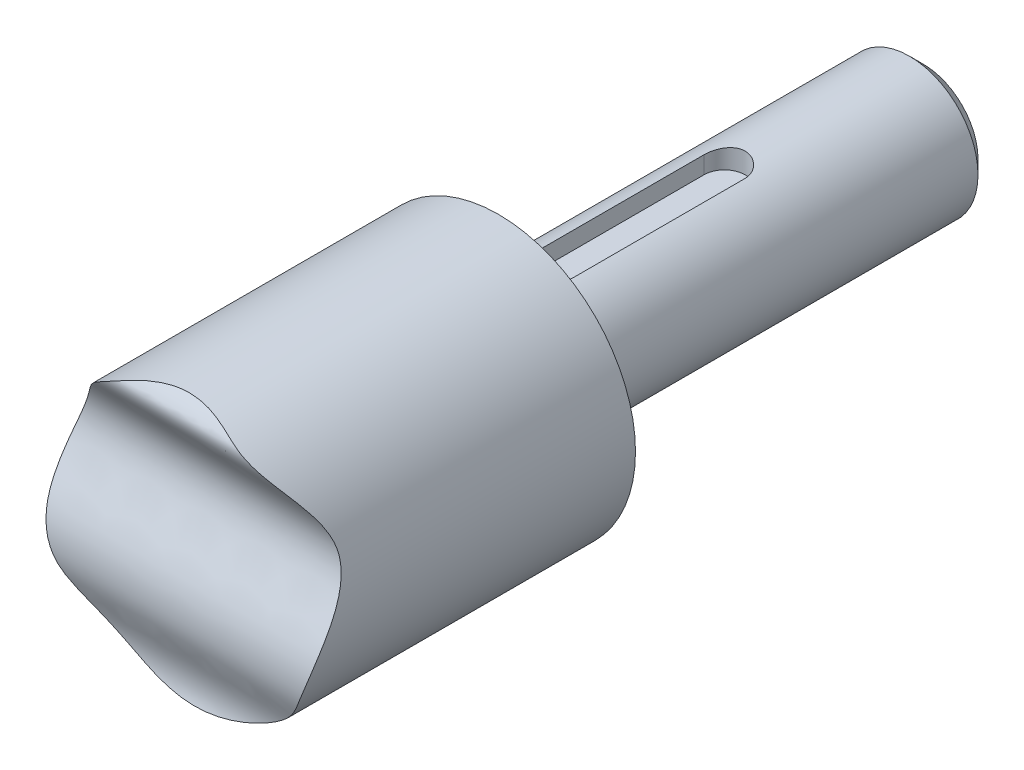
ISO-10303-21;
HEADER;
FILE_DESCRIPTION(('STEP AP214'),'2;1');
FILE_NAME('part.step','',(''),(''),'','','');
FILE_SCHEMA(('AUTOMOTIVE_DESIGN { 1 0 10303 214 1 1 1 1 }'));
ENDSEC;
DATA;
#1=APPLICATION_CONTEXT('core data for automotive mechanical design processes');
#2=APPLICATION_PROTOCOL_DEFINITION('international standard','automotive_design',2000,#1);
#3=PRODUCT_CONTEXT('',#1,'mechanical');
#4=PRODUCT('Part','Part','',(#3));
#5=PRODUCT_RELATED_PRODUCT_CATEGORY('part','',(#4));
#6=PRODUCT_DEFINITION_FORMATION('','',#4);
#7=PRODUCT_DEFINITION_CONTEXT('part definition',#1,'design');
#8=PRODUCT_DEFINITION('design','',#6,#7);
#9=PRODUCT_DEFINITION_SHAPE('','',#8);
#10=(LENGTH_UNIT() NAMED_UNIT(*) SI_UNIT(.MILLI.,.METRE.));
#11=(NAMED_UNIT(*) PLANE_ANGLE_UNIT() SI_UNIT($,.RADIAN.));
#12=(NAMED_UNIT(*) SI_UNIT($,.STERADIAN.) SOLID_ANGLE_UNIT());
#13=UNCERTAINTY_MEASURE_WITH_UNIT(LENGTH_MEASURE(1.E-05),#10,'distance_accuracy_value','');
#14=(GEOMETRIC_REPRESENTATION_CONTEXT(3) GLOBAL_UNCERTAINTY_ASSIGNED_CONTEXT((#13)) GLOBAL_UNIT_ASSIGNED_CONTEXT((#10,
#11,#12)) REPRESENTATION_CONTEXT('',''));
#15=CARTESIAN_POINT('',(0.,0.,0.));
#16=DIRECTION('',(0.,0.,1.));
#17=DIRECTION('',(1.,0.,0.));
#18=AXIS2_PLACEMENT_3D('',#15,#16,#17);
#19=CARTESIAN_POINT('',(0.,0.,-23.9999564100499));
#20=DIRECTION('',(0.,0.,-1.));
#21=DIRECTION('',(0.,1.,0.));
#22=AXIS2_PLACEMENT_3D('',#19,#20,#21);
#23=CYLINDRICAL_SURFACE('',#22,10.);
#24=CARTESIAN_POINT('',(0.,0.,-21.9999564100499));
#25=DIRECTION('',(0.,0.,1.));
#26=DIRECTION('',(0.,-1.,0.));
#27=AXIS2_PLACEMENT_3D('',#24,#25,#26);
#28=CIRCLE('',#27,10.);
#29=CARTESIAN_POINT('',(0.,-10.,-21.9999564100499));
#30=VERTEX_POINT('',#29);
#31=EDGE_CURVE('E13',#30,#30,#28,.T.);
#32=ORIENTED_EDGE('',*,*,#31,.T.);
#33=EDGE_LOOP('',(#32));
#34=FACE_BOUND('',#33,.T.);
#35=CARTESIAN_POINT('',(0.,0.,38.0000435899501));
#36=DIRECTION('',(0.,0.,-1.));
#37=DIRECTION('',(0.,1.,0.));
#38=AXIS2_PLACEMENT_3D('',#35,#36,#37);
#39=CIRCLE('',#38,9.99999999999999);
#40=CARTESIAN_POINT('',(0.,9.99999999999999,38.0000435899501));
#41=VERTEX_POINT('',#40);
#42=EDGE_CURVE('E99',#41,#41,#39,.T.);
#43=ORIENTED_EDGE('',*,*,#42,.T.);
#44=EDGE_LOOP('',(#43));
#45=FACE_BOUND('',#44,.T.);
#46=CARTESIAN_POINT('',(3.,9.53939201416945,5.));
#47=CARTESIAN_POINT('',(3.00001027845727,9.53938054248206,4.91766447917731));
#48=CARTESIAN_POINT('',(2.99661062684472,9.54045772064378,4.83533554493678));
#49=CARTESIAN_POINT('',(2.98307142899347,9.54470412105985,4.67130604723454));
#50=CARTESIAN_POINT('',(2.97293339805418,9.54787287296848,4.58960534667565));
#51=CARTESIAN_POINT('',(2.94603140625045,9.55620668351003,4.42761508432683));
#52=CARTESIAN_POINT('',(2.92928426957737,9.56136667250114,4.34732247595697));
#53=CARTESIAN_POINT('',(2.88932853030394,9.57351626651178,4.18852415586577));
#54=CARTESIAN_POINT('',(2.8661197587264,9.58050591937827,4.1100184909326));
#55=CARTESIAN_POINT('',(2.78708584446024,9.60391637654136,3.87805061200985));
#56=CARTESIAN_POINT('',(2.72181852542972,9.6227900783039,3.72793156116699));
#57=CARTESIAN_POINT('',(2.56815043531275,9.66493213967819,3.44077395602096));
#58=CARTESIAN_POINT('',(2.4797388992416,9.6882025429064,3.30374152923783));
#59=CARTESIAN_POINT('',(2.27929879634442,9.73733650515374,3.04227701205217));
#60=CARTESIAN_POINT('',(2.16666914746584,9.76325505469873,2.91831512593909));
#61=CARTESIAN_POINT('',(1.92227736150433,9.81429628475076,2.69072638516125));
#62=CARTESIAN_POINT('',(1.79051199848163,9.83941883019409,2.58710296613899));
#63=CARTESIAN_POINT('',(1.50821997465697,9.88666477976534,2.40107313490544));
#64=CARTESIAN_POINT('',(1.35736167401015,9.90871541546877,2.31914982021738));
#65=CARTESIAN_POINT('',(1.04324233568303,9.94668940088144,2.18202299599707));
#66=CARTESIAN_POINT('',(0.879984508687983,9.96261433032402,2.12681259663205));
#67=CARTESIAN_POINT('',(0.5506494048206,9.98615279768397,2.046240448209));
#68=CARTESIAN_POINT('',(0.384786253016202,9.99399098526792,2.02007029648239));
#69=CARTESIAN_POINT('',(0.0508471415689269,10.0012640407204,1.99576530485396));
#70=CARTESIAN_POINT('',(-0.11722839312534,10.0007004995012,1.99762515732183));
#71=CARTESIAN_POINT('',(-0.445143199271825,9.99139205125586,2.02878582069144));
#72=CARTESIAN_POINT('',(-0.605074290763028,9.98290831016512,2.05721069080812));
#73=CARTESIAN_POINT('',(-0.917780104370314,9.95903027401822,2.13926326962549));
#74=CARTESIAN_POINT('',(-1.07055445110879,9.94363561692558,2.19289229868268));
#75=CARTESIAN_POINT('',(-1.36669563173912,9.90730429851781,2.32442444352475));
#76=CARTESIAN_POINT('',(-1.50993201207613,9.88630511384914,2.4026032887761));
#77=CARTESIAN_POINT('',(-1.781531059161,9.84099249303646,2.58079718003441));
#78=CARTESIAN_POINT('',(-1.9098903832325,9.81667831471805,2.6808171189407));
#79=CARTESIAN_POINT('',(-2.15330901082205,9.76623347142779,2.90438397618464));
#80=CARTESIAN_POINT('',(-2.26766702955975,9.74006890899096,3.02868772752621));
#81=CARTESIAN_POINT('',(-2.47413538985067,9.68968430229327,3.29499484685111));
#82=CARTESIAN_POINT('',(-2.5662392402618,9.66546482675133,3.43700336072978));
#83=CARTESIAN_POINT('',(-2.72632814481701,9.62154457591302,3.73656185689986));
#84=CARTESIAN_POINT('',(-2.79406012682262,9.60189192491895,3.89425435918714));
#85=CARTESIAN_POINT('',(-2.90171772009404,9.56991327306402,4.21944900796315));
#86=CARTESIAN_POINT('',(-2.94168586436072,9.55757606951749,4.38693572142869));
#87=CARTESIAN_POINT('',(-2.97802407180158,9.54628064650011,4.6299897781404));
#88=CARTESIAN_POINT('',(-2.98626405978017,9.54370312550533,4.70378146835922));
#89=CARTESIAN_POINT('',(-2.99724711229708,9.54025857223564,4.85170295819904));
#90=CARTESIAN_POINT('',(-2.99999825936538,9.53938902493287,4.92583209932769));
#91=CARTESIAN_POINT('',(-3.,9.53939201416945,5.));
#92=B_SPLINE_CURVE_WITH_KNOTS('',3,(#46,#47,#48,#49,#50,#51,#52,#53,#54,#55,#56,#57,#58,#59,#60,
#61,#62,#63,#64,#65,#66,#67,#68,#69,#70,#71,#72,#73,#74,#75,#76,#77,#78,#79,#80,#81,#82,#83,#84,
#85,#86,#87,#88,#89,#90,#91),.UNSPECIFIED.,.F.,.F.,(4,2,2,2,2,2,2,2,2,2,2,2,2,2,2,2,2,2,2,2,2,2,
4),(0.,0.246918142439467,0.493780777706084,0.740019009623011,0.986263681482024,1.47813347402025,
1.97023245590779,2.47635119822766,2.98255536239033,3.4992281062007,4.01576751791672,
4.51753600864764,5.019209488041,5.50490358251092,5.99062312360831,6.48200583350621,
6.97349873739169,7.48389234847121,7.99443465298714,8.51013494368213,9.02504345105573,
9.24774267716777,9.4701137273239),.UNSPECIFIED.);
#93=CARTESIAN_POINT('',(3.,9.53939201416945,5.));
#94=VERTEX_POINT('',#93);
#95=CARTESIAN_POINT('',(-3.,9.53939201416945,5.));
#96=VERTEX_POINT('',#95);
#97=EDGE_CURVE('E75',#94,#96,#92,.T.);
#98=ORIENTED_EDGE('',*,*,#97,.F.);
#99=DIRECTION('',(0.,0.,-1.));
#100=VECTOR('',#99,1.);
#101=CARTESIAN_POINT('',(2.99999999999999,9.53939201416946,-23.9999564100499));
#102=LINE('',#101,#100);
#103=CARTESIAN_POINT('',(2.99999999999999,9.53939201416945,30.));
#104=VERTEX_POINT('',#103);
#105=EDGE_CURVE('E132',#104,#94,#102,.T.);
#106=ORIENTED_EDGE('',*,*,#105,.F.);
#107=CARTESIAN_POINT('',(-3.,9.53939201416945,30.));
#108=CARTESIAN_POINT('',(-3.00001027845728,9.53938054248206,30.0823355208227));
#109=CARTESIAN_POINT('',(-2.99661062684472,9.54045772064377,30.1646644550632));
#110=CARTESIAN_POINT('',(-2.98307142899347,9.54470412105985,30.3286939527655));
#111=CARTESIAN_POINT('',(-2.97293339805418,9.54787287296848,30.4103946533244));
#112=CARTESIAN_POINT('',(-2.94603140625045,9.55620668351002,30.5723849156732));
#113=CARTESIAN_POINT('',(-2.92928426957737,9.56136667250114,30.652677524043));
#114=CARTESIAN_POINT('',(-2.88932853030395,9.57351626651178,30.8114758441342));
#115=CARTESIAN_POINT('',(-2.8661197587264,9.58050591937827,30.8899815090674));
#116=CARTESIAN_POINT('',(-2.78708584446024,9.60391637654136,31.1219493879902));
#117=CARTESIAN_POINT('',(-2.72181852542972,9.6227900783039,31.272068438833));
#118=CARTESIAN_POINT('',(-2.56815043531275,9.66493213967818,31.559226043979));
#119=CARTESIAN_POINT('',(-2.47973889924159,9.6882025429064,31.6962584707622));
#120=CARTESIAN_POINT('',(-2.27929879634442,9.73733650515374,31.9577229879478));
#121=CARTESIAN_POINT('',(-2.16666914746584,9.76325505469873,32.0816848740609));
#122=CARTESIAN_POINT('',(-1.92227736150433,9.81429628475076,32.3092736148388));
#123=CARTESIAN_POINT('',(-1.79051199848163,9.83941883019409,32.412897033861));
#124=CARTESIAN_POINT('',(-1.50821997465696,9.88666477976533,32.5989268650946));
#125=CARTESIAN_POINT('',(-1.35736167401015,9.90871541546877,32.6808501797826));
#126=CARTESIAN_POINT('',(-1.04324233568302,9.94668940088143,32.8179770040029));
#127=CARTESIAN_POINT('',(-0.879984508687982,9.96261433032402,32.873187403368));
#128=CARTESIAN_POINT('',(-0.550649404820599,9.98615279768397,32.953759551791));
#129=CARTESIAN_POINT('',(-0.3847862530162,9.99399098526791,32.9799297035176));
#130=CARTESIAN_POINT('',(-0.0508471415689239,10.0012640407204,33.004234695146));
#131=CARTESIAN_POINT('',(0.117228393125343,10.0007004995012,33.0023748426782));
#132=CARTESIAN_POINT('',(0.445143199271829,9.99139205125585,32.9712141793086));
#133=CARTESIAN_POINT('',(0.605074290763034,9.98290831016511,32.9427893091919));
#134=CARTESIAN_POINT('',(0.917780104370319,9.95903027401821,32.8607367303745));
#135=CARTESIAN_POINT('',(1.07055445110879,9.94363561692557,32.8071077013173));
#136=CARTESIAN_POINT('',(1.36669563173912,9.90730429851781,32.6755755564752));
#137=CARTESIAN_POINT('',(1.50993201207613,9.88630511384914,32.5973967112239));
#138=CARTESIAN_POINT('',(1.78153105916101,9.84099249303646,32.4192028199656));
#139=CARTESIAN_POINT('',(1.90989038323251,9.81667831471805,32.3191828810593));
#140=CARTESIAN_POINT('',(2.15330901082206,9.76623347142779,32.0956160238154));
#141=CARTESIAN_POINT('',(2.26766702955976,9.74006890899096,31.9713122724738));
#142=CARTESIAN_POINT('',(2.47413538985067,9.68968430229326,31.7050051531489));
#143=CARTESIAN_POINT('',(2.5662392402618,9.66546482675133,31.5629966392702));
#144=CARTESIAN_POINT('',(2.72632814481701,9.62154457591302,31.2634381431001));
#145=CARTESIAN_POINT('',(2.79406012682263,9.60189192491894,31.1057456408129));
#146=CARTESIAN_POINT('',(2.90171772009404,9.56991327306401,30.7805509920368));
#147=CARTESIAN_POINT('',(2.94168586436072,9.55757606951749,30.6130642785713));
#148=CARTESIAN_POINT('',(2.97802407180159,9.54628064650011,30.3700102218596));
#149=CARTESIAN_POINT('',(2.98626405978017,9.54370312550532,30.2962185316408));
#150=CARTESIAN_POINT('',(2.99724711229708,9.54025857223563,30.148297041801));
#151=CARTESIAN_POINT('',(2.99999825936538,9.53938902493287,30.0741679006723));
#152=CARTESIAN_POINT('',(3.,9.53939201416945,30.));
#153=B_SPLINE_CURVE_WITH_KNOTS('',3,(#107,#108,#109,#110,#111,#112,#113,#114,#115,#116,#117,
#118,#119,#120,#121,#122,#123,#124,#125,#126,#127,#128,#129,#130,#131,#132,#133,#134,#135,#136,
#137,#138,#139,#140,#141,#142,#143,#144,#145,#146,#147,#148,#149,#150,#151,#152),.UNSPECIFIED.,
.F.,.F.,(4,2,2,2,2,2,2,2,2,2,2,2,2,2,2,2,2,2,2,2,2,2,4),(0.,0.246918142439467,0.493780777706087,
0.740019009623013,0.986263681482027,1.47813347402026,1.97023245590779,2.47635119822766,
2.98255536239033,3.49922810620071,4.01576751791672,4.51753600864764,5.01920948804101,
5.50490358251093,5.99062312360832,6.48200583350621,6.9734987373917,7.48389234847122,
7.99443465298715,8.51013494368214,9.02504345105574,9.24774267716776,9.47011372732391),.UNSPECIFIED.);
#154=CARTESIAN_POINT('',(-3.,9.53939201416945,30.));
#155=VERTEX_POINT('',#154);
#156=EDGE_CURVE('E134',#155,#104,#153,.T.);
#157=ORIENTED_EDGE('',*,*,#156,.F.);
#158=DIRECTION('',(0.,0.,-1.));
#159=VECTOR('',#158,1.);
#160=CARTESIAN_POINT('',(-3.,9.53939201416945,-23.9999564100499));
#161=LINE('',#160,#159);
#162=EDGE_CURVE('E141',#96,#155,#161,.F.);
#163=ORIENTED_EDGE('',*,*,#162,.F.);
#164=EDGE_LOOP('',(#98,#106,#157,#163));
#165=FACE_BOUND('',#164,.T.);
#166=ADVANCED_FACE('F47',(#34,#45,#165),#23,.T.);
#167=CARTESIAN_POINT('',(0.,-19.9999171820058,38.0000435899501));
#168=DIRECTION('',(0.,0.,1.));
#169=DIRECTION('',(0.,-1.,0.));
#170=AXIS2_PLACEMENT_3D('',#167,#168,#169);
#171=PLANE('',#170);
#172=ORIENTED_EDGE('',*,*,#42,.F.);
#173=EDGE_LOOP('',(#172));
#174=FACE_BOUND('',#173,.T.);
#175=CARTESIAN_POINT('',(0.,0.,38.0000435899501));
#176=DIRECTION('',(0.,0.,-1.));
#177=DIRECTION('',(0.,1.,0.));
#178=AXIS2_PLACEMENT_3D('',#175,#176,#177);
#179=CIRCLE('',#178,19.9999171820058);
#180=CARTESIAN_POINT('',(0.,19.9999171820058,38.0000435899501));
#181=VERTEX_POINT('',#180);
#182=EDGE_CURVE('E129',#181,#181,#179,.T.);
#183=ORIENTED_EDGE('',*,*,#182,.T.);
#184=EDGE_LOOP('',(#183));
#185=FACE_BOUND('',#184,.T.);
#186=ADVANCED_FACE('F176',(#174,#185),#171,.F.);
#187=CARTESIAN_POINT('',(0.,0.,-23.9999564100499));
#188=DIRECTION('',(0.,0.,-1.));
#189=DIRECTION('',(0.,1.,0.));
#190=AXIS2_PLACEMENT_3D('',#187,#188,#189);
#191=CYLINDRICAL_SURFACE('',#190,19.9999171820058);
#192=CARTESIAN_POINT('',(0.,19.9999171820058,83.1131420398787));
#193=CARTESIAN_POINT('',(0.172607013594049,19.9999182605709,83.1131397401418));
#194=CARTESIAN_POINT('',(0.34519365917922,19.9976823694984,83.115935648925));
#195=CARTESIAN_POINT('',(0.690115601112561,19.9887513784537,83.1270876705627));
#196=CARTESIAN_POINT('',(0.862450841953178,19.9820554099745,83.1354448663617));
#197=CARTESIAN_POINT('',(1.20654946296128,19.9642333649262,83.1576397237908));
#198=CARTESIAN_POINT('',(1.37831279165192,19.9531068998941,83.1714778659861));
#199=CARTESIAN_POINT('',(1.72105385121197,19.926470273966,83.20449043886));
#200=CARTESIAN_POINT('',(1.89203123540925,19.91095833793,83.2236670303747));
#201=CARTESIAN_POINT('',(2.23286730007371,19.8756218270013,83.2671265053922));
#202=CARTESIAN_POINT('',(2.40272609550907,19.8557977026727,83.2914088554049));
#203=CARTESIAN_POINT('',(2.74108110458562,19.8119221289144,83.3447577597956));
#204=CARTESIAN_POINT('',(2.90957771560951,19.7878719625711,83.3738228618924));
#205=CARTESIAN_POINT('',(3.3203826552327,19.7239002414198,83.4503738196378));
#206=CARTESIAN_POINT('',(3.56189031821537,19.6816989804585,83.5002737099415));
#207=CARTESIAN_POINT('',(4.04164257542617,19.5888120515612,83.6077495164254));
#208=CARTESIAN_POINT('',(4.27988549838182,19.5381222017108,83.6653292132126));
#209=CARTESIAN_POINT('',(4.75328177349145,19.4283844201031,83.7862915759885));
#210=CARTESIAN_POINT('',(4.98843064117976,19.3693255636479,83.8496817880692));
#211=CARTESIAN_POINT('',(5.45587500724733,19.2428904933143,83.9800719279742));
#212=CARTESIAN_POINT('',(5.68816558977135,19.1755016927216,84.0470772300251));
#213=CARTESIAN_POINT('',(6.0339478016307,19.0683675122737,84.1483474147605));
#214=CARTESIAN_POINT('',(6.14854250621926,19.0317259288207,84.182163638354));
#215=CARTESIAN_POINT('',(6.37708823463167,18.9563685705433,84.2496596398739));
#216=CARTESIAN_POINT('',(6.4910392543467,18.9176527824952,84.2833394169288));
#217=CARTESIAN_POINT('',(6.83188066566851,18.7984053091351,84.3832499982731));
#218=CARTESIAN_POINT('',(7.05799027957055,18.7147020043757,84.4484219591885));
#219=CARTESIAN_POINT('',(7.50835970467511,18.5385958048705,84.5707113359826));
#220=CARTESIAN_POINT('',(7.73262271173204,18.4462149875109,84.6278483157762));
#221=CARTESIAN_POINT('',(8.17998731501274,18.2522262831653,84.7282043506532));
#222=CARTESIAN_POINT('',(8.4030902316864,18.1506342109218,84.7714467021799));
#223=CARTESIAN_POINT('',(8.75399330656971,17.9828967820079,84.8234421533534));
#224=CARTESIAN_POINT('',(8.88226517526912,17.9198929428518,84.8390486217301));
#225=CARTESIAN_POINT('',(9.07409926301797,17.8230902201347,84.8562611924352));
#226=CARTESIAN_POINT('',(9.13796344661091,17.7904317852579,84.8609662417183));
#227=CARTESIAN_POINT('',(9.26543368470997,17.7243781280064,84.8681899325577));
#228=CARTESIAN_POINT('',(9.32903973618977,17.6909828970229,84.8707085485537));
#229=CARTESIAN_POINT('',(9.51935282312731,17.5897483072117,84.8750490488639));
#230=CARTESIAN_POINT('',(9.64558289323817,17.52084587324,84.8736580995072));
#231=CARTESIAN_POINT('',(9.89599579456761,17.3806362096036,84.8626433321939));
#232=CARTESIAN_POINT('',(10.0201820939237,17.3093338558875,84.8530353410969));
#233=CARTESIAN_POINT('',(10.266413028737,17.1644359913332,84.8260837412559));
#234=CARTESIAN_POINT('',(10.3884568745192,17.0908396616055,84.8087373399925));
#235=CARTESIAN_POINT('',(10.6300621205154,16.9416243750533,84.7668729661081));
#236=CARTESIAN_POINT('',(10.7496231262029,16.866005101083,84.7423538629335));
#237=CARTESIAN_POINT('',(11.0340580724028,16.6818897093037,84.6754700779017));
#238=CARTESIAN_POINT('',(11.1976138699111,16.5725143591594,84.6299020108771));
#239=CARTESIAN_POINT('',(11.5190699020416,16.3507149412514,84.5275765166606));
#240=CARTESIAN_POINT('',(11.6769685946494,16.2382900566996,84.4708160656587));
#241=CARTESIAN_POINT('',(11.987050742256,16.0107554791407,84.3478259177395));
#242=CARTESIAN_POINT('',(12.1392332765782,15.8956453584332,84.2815947035956));
#243=CARTESIAN_POINT('',(12.4390218913109,15.6621765543746,84.1407744126047));
#244=CARTESIAN_POINT('',(12.5865884790213,15.5438007713397,84.0661300754072));
#245=CARTESIAN_POINT('',(12.8762269974959,15.3047288071794,83.9103535543258));
#246=CARTESIAN_POINT('',(13.0183002053396,15.1840331752504,83.8292228919757));
#247=CARTESIAN_POINT('',(13.2972716057706,14.9403328662858,83.6617796159559));
#248=CARTESIAN_POINT('',(13.4341702075596,14.8173283729883,83.5754674134391));
#249=CARTESIAN_POINT('',(13.7962842904318,14.4829316481235,83.3376699866786));
#250=CARTESIAN_POINT('',(14.017002712548,14.2693232707194,83.1824471776543));
#251=CARTESIAN_POINT('',(14.4462255205843,13.8346157363085,82.8655322564643));
#252=CARTESIAN_POINT('',(14.6547242923393,13.6135132087052,82.7038372272511));
#253=CARTESIAN_POINT('',(15.0609919464301,13.1626507742406,82.3784268635212));
#254=CARTESIAN_POINT('',(15.2587513609343,12.932883521447,82.2147098976437));
#255=CARTESIAN_POINT('',(15.6441666313884,12.4638959787247,81.8901611882109));
#256=CARTESIAN_POINT('',(15.831839331232,12.2246926830244,81.729324953893));
#257=CARTESIAN_POINT('',(16.1981443036713,11.7350005024471,81.4152212819465));
#258=CARTESIAN_POINT('',(16.3767837461525,11.4845208761225,81.2619478439861));
#259=CARTESIAN_POINT('',(16.7254855006481,10.9704678791983,80.9686818745757));
#260=CARTESIAN_POINT('',(16.8955567801343,10.7069087964761,80.8286753167845));
#261=CARTESIAN_POINT('',(17.1757078249107,10.2488887203936,80.609358663265));
#262=CARTESIAN_POINT('',(17.2880234048776,10.0583720688102,80.5246974703588));
#263=CARTESIAN_POINT('',(17.5084060155405,9.66965998547706,80.3680168943248));
#264=CARTESIAN_POINT('',(17.6164717943981,9.47146232481119,80.2960012147826));
#265=CARTESIAN_POINT('',(17.8271025109859,9.06875860298124,80.1685669092263));
#266=CARTESIAN_POINT('',(17.9296999902214,8.86430490057954,80.1130382385816));
#267=CARTESIAN_POINT('',(18.1293898550696,8.44837221301601,80.0218399498137));
#268=CARTESIAN_POINT('',(18.2264859520425,8.23689812046546,79.9861567966568));
#269=CARTESIAN_POINT('',(18.3520387282734,7.95019846040942,79.9543077028394));
#270=CARTESIAN_POINT('',(18.3834261483608,7.87734990212549,79.9476137322622));
#271=CARTESIAN_POINT('',(18.4454040139999,7.73110992006222,79.9371086732146));
#272=CARTESIAN_POINT('',(18.4759945033085,7.65771852637348,79.9332974261399));
#273=CARTESIAN_POINT('',(18.5665200067415,7.43682310978407,79.9261594944704));
#274=CARTESIAN_POINT('',(18.6251898454001,7.28864170378618,79.9271335099995));
#275=CARTESIAN_POINT('',(18.7388128960945,6.99134598118981,79.9397739310182));
#276=CARTESIAN_POINT('',(18.7937659765884,6.84223163177684,79.951440714729));
#277=CARTESIAN_POINT('',(18.9000478231001,6.54295238094529,79.9846337350791));
#278=CARTESIAN_POINT('',(18.9513565315925,6.39278601655377,80.0062102869252));
#279=CARTESIAN_POINT('',(19.0499573293119,6.09268129523691,80.0582133332671));
#280=CARTESIAN_POINT('',(19.0972492772796,5.94274294651227,80.0886401388381));
#281=CARTESIAN_POINT('',(19.1878240103938,5.64345196412226,80.1573084181924));
#282=CARTESIAN_POINT('',(19.2311064095777,5.49409938816635,80.1955506431613));
#283=CARTESIAN_POINT('',(19.3337128412134,5.12414223356433,80.299000695593));
#284=CARTESIAN_POINT('',(19.3906672288486,4.90402320588214,80.368303489572));
#285=CARTESIAN_POINT('',(19.4962425285062,4.46587533699313,80.5189283043098));
#286=CARTESIAN_POINT('',(19.5448598223236,4.24784744187067,80.6002555151614));
#287=CARTESIAN_POINT('',(19.6341604774484,3.81385941848999,80.7723367896496));
#288=CARTESIAN_POINT('',(19.6748416486019,3.59789987663276,80.8630934449955));
#289=CARTESIAN_POINT('',(19.7487817266923,3.16705908925409,81.0521369988967));
#290=CARTESIAN_POINT('',(19.7820123313897,2.95218488823351,81.1504507679836));
#291=CARTESIAN_POINT('',(19.8411864931895,2.52402402491731,81.3523341874824));
#292=CARTESIAN_POINT('',(19.8671327407487,2.31073680488499,81.4559018806408));
#293=CARTESIAN_POINT('',(19.9120153834186,1.88522836001709,81.6666249133538));
#294=CARTESIAN_POINT('',(19.9309521279715,1.67300708256192,81.7737800737733));
#295=CARTESIAN_POINT('',(19.9683288353748,1.16277469498834,82.0342316965846));
#296=CARTESIAN_POINT('',(19.9834238165476,0.865033836786514,82.1885421817944));
#297=CARTESIAN_POINT('',(20.000326390193,0.269192133211233,82.4973366404988));
#298=CARTESIAN_POINT('',(20.0021310462426,-0.028908777163214,82.6518206447909));
#299=CARTESIAN_POINT('',(19.992324798457,-0.627026343441681,82.9571733665106));
#300=CARTESIAN_POINT('',(19.9807045080311,-0.927044193719018,83.1080394790208));
#301=CARTESIAN_POINT('',(19.9436702249041,-1.52877607755031,83.4012665998077));
#302=CARTESIAN_POINT('',(19.9183171863313,-1.83047682804479,83.5436621288177));
#303=CARTESIAN_POINT('',(19.8531371094794,-2.43779827613638,83.8159248069627));
#304=CARTESIAN_POINT('',(19.8133193125347,-2.7434163510099,83.9457998883514));
#305=CARTESIAN_POINT('',(19.7182618825378,-3.35911080888065,84.1875334440428));
#306=CARTESIAN_POINT('',(19.6630371713865,-3.66918260411574,84.2994091865802));
#307=CARTESIAN_POINT('',(19.5459051438776,-4.24585931757572,84.4866900546184));
#308=CARTESIAN_POINT('',(19.4862638636365,-4.51196254494396,84.5650511088117));
#309=CARTESIAN_POINT('',(19.3548982020216,-5.04580280765633,84.7043813028559));
#310=CARTESIAN_POINT('',(19.2831734647673,-5.31353989089669,84.7653499303249));
#311=CARTESIAN_POINT('',(19.1277430196442,-5.84837055321,84.8676717420754));
#312=CARTESIAN_POINT('',(19.0440759336125,-6.11546348837857,84.9090863731094));
#313=CARTESIAN_POINT('',(18.8647236812045,-6.64814340400373,84.9708088926041));
#314=CARTESIAN_POINT('',(18.769037620121,-6.91373027080683,84.9911152086911));
#315=CARTESIAN_POINT('',(18.5996916966554,-7.35418661419088,85.0063430850207));
#316=CARTESIAN_POINT('',(18.5291791870998,-7.53007908369861,85.00742902868));
#317=CARTESIAN_POINT('',(18.3832663861683,-7.87959680355335,84.9993571447094));
#318=CARTESIAN_POINT('',(18.3078662409447,-8.05322212150744,84.9901996232516));
#319=CARTESIAN_POINT('',(18.1525426126618,-8.3974719481994,84.9615820519511));
#320=CARTESIAN_POINT('',(18.0726212766531,-8.56809783169727,84.9421268562533));
#321=CARTESIAN_POINT('',(17.9081987639041,-8.90666508812718,84.8929333836785));
#322=CARTESIAN_POINT('',(17.8236772329707,-9.07458940263025,84.8631456333411));
#323=CARTESIAN_POINT('',(17.6508348068242,-9.40636686861561,84.793464724657));
#324=CARTESIAN_POINT('',(17.5625130419964,-9.57021907459116,84.7535692430193));
#325=CARTESIAN_POINT('',(17.382325098398,-9.89372288208307,84.6655854772222));
#326=CARTESIAN_POINT('',(17.2904582148885,-10.0533736376672,84.6174955575217));
#327=CARTESIAN_POINT('',(17.061879425152,-10.4383379573509,84.4923886357913));
#328=CARTESIAN_POINT('',(16.9233127488233,-10.6614445359006,84.4119880965019));
#329=CARTESIAN_POINT('',(16.639020856898,-11.0999091009801,84.2429794750289));
#330=CARTESIAN_POINT('',(16.493292694678,-11.3152638337641,84.1543680009153));
#331=CARTESIAN_POINT('',(16.194328206057,-11.7391541601936,83.9729003972021));
#332=CARTESIAN_POINT('',(16.0410853465026,-11.9476835476813,83.8800405790384));
#333=CARTESIAN_POINT('',(15.7267229856911,-12.3585523381082,83.6934933516421));
#334=CARTESIAN_POINT('',(15.5655988579544,-12.5608879890939,83.5998054834149));
#335=CARTESIAN_POINT('',(15.2355846229119,-12.9591795251043,83.414850392398));
#336=CARTESIAN_POINT('',(15.0667179710336,-13.155151957208,83.3235770287824));
#337=CARTESIAN_POINT('',(14.72048633597,-13.5414622242577,83.1457602541177));
#338=CARTESIAN_POINT('',(14.5431261713111,-13.7318031571753,83.0592142194538));
#339=CARTESIAN_POINT('',(14.1796570047911,-14.1068116759085,82.8930614361522));
#340=CARTESIAN_POINT('',(13.9935546278535,-14.2914833878663,82.8134495592833));
#341=CARTESIAN_POINT('',(13.6124070099168,-14.6549780748809,82.662967384919));
#342=CARTESIAN_POINT('',(13.4173643626538,-14.8338027208046,82.5920945738048));
#343=CARTESIAN_POINT('',(13.0081473001185,-15.1941720054285,82.4571478177576));
#344=CARTESIAN_POINT('',(12.7935046422947,-15.3753869193487,82.3936079531963));
#345=CARTESIAN_POINT('',(12.3546902915058,-15.7301598644552,82.2788794753255));
#346=CARTESIAN_POINT('',(12.130516252865,-15.9037159891436,82.2276939233525));
#347=CARTESIAN_POINT('',(11.6733413916055,-16.2422497047487,82.1381724189662));
#348=CARTESIAN_POINT('',(11.4403416830426,-16.407228372193,82.0998348507408));
#349=CARTESIAN_POINT('',(10.965592300117,-16.7282642631878,82.035709475801));
#350=CARTESIAN_POINT('',(10.7238188953249,-16.8842938055623,82.0099589304951));
#351=CARTESIAN_POINT('',(10.2330315027832,-17.1861797829204,81.9703498771569));
#352=CARTESIAN_POINT('',(9.98401658331524,-17.3320349005486,81.9564929064548));
#353=CARTESIAN_POINT('',(9.47961921775538,-17.6129737638034,81.9393483987997));
#354=CARTESIAN_POINT('',(9.22423642279147,-17.748056917565,81.9360614422261));
#355=CARTESIAN_POINT('',(8.80415545881255,-17.9587407582622,81.9379306652349));
#356=CARTESIAN_POINT('',(8.64113350378402,-18.0377466500484,81.9403966424115));
#357=CARTESIAN_POINT('',(8.3130581137087,-18.1912767392933,81.9483705547342));
#358=CARTESIAN_POINT('',(8.14800462199085,-18.2658008113857,81.953878574929));
#359=CARTESIAN_POINT('',(7.8159859596241,-18.4103188560619,81.9673961059965));
#360=CARTESIAN_POINT('',(7.649020362949,-18.4803117950313,81.9754061852131));
#361=CARTESIAN_POINT('',(7.31334332124573,-18.6157044618424,81.9932792106645));
#362=CARTESIAN_POINT('',(7.14463188361599,-18.6811042091397,82.0031421490504));
#363=CARTESIAN_POINT('',(6.63596798812152,-18.8703876587711,82.0346795470581));
#364=CARTESIAN_POINT('',(6.29352829775463,-18.9873371403336,82.0583005725017));
#365=CARTESIAN_POINT('',(5.60290836926001,-19.2024722828528,82.1070072342529));
#366=CARTESIAN_POINT('',(5.25472771594689,-19.3006565801919,82.1320929768249));
#367=CARTESIAN_POINT('',(4.55353525109,-19.4780067119996,82.1808067042373));
#368=CARTESIAN_POINT('',(4.2005245917724,-19.5571770015556,82.2044350295924));
#369=CARTESIAN_POINT('',(3.49050887568638,-19.6962910408085,82.2479348239883));
#370=CARTESIAN_POINT('',(3.1335040352029,-19.7562358264015,82.2678064954191));
#371=CARTESIAN_POINT('',(2.50247207436784,-19.844648547654,82.2979656634946));
#372=CARTESIAN_POINT('',(2.22906777586993,-19.87721730613,82.3094087386063));
#373=CARTESIAN_POINT('',(1.68099422239633,-19.9310502311218,82.3285927101571));
#374=CARTESIAN_POINT('',(1.40632489056231,-19.9523137013856,82.3363333785753));
#375=CARTESIAN_POINT('',(0.856250500768262,-19.9834785374954,82.3477504706686));
#376=CARTESIAN_POINT('',(0.58084542235417,-19.9933795840962,82.351426780149));
#377=CARTESIAN_POINT('',(0.0298422977978996,-20.0017927452849,82.3545477236593));
#378=CARTESIAN_POINT('',(-0.245755744279954,-20.0003050929373,82.3539924442868));
#379=CARTESIAN_POINT('',(-0.79693778640567,-19.9859367841779,82.3486722602918));
#380=CARTESIAN_POINT('',(-1.07252138876856,-19.9730427312024,82.3439024057523));
#381=CARTESIAN_POINT('',(-1.62282580927202,-19.9358767308739,82.3303650921667));
#382=CARTESIAN_POINT('',(-1.89754660852932,-19.9116045362222,82.3215975462328));
#383=CARTESIAN_POINT('',(-2.44560669863313,-19.8517425122712,82.3004740946649));
#384=CARTESIAN_POINT('',(-2.71894601992811,-19.8161529335275,82.2881182684724));
#385=CARTESIAN_POINT('',(-3.263748111549,-19.7337411254571,82.2604192057815));
#386=CARTESIAN_POINT('',(-3.53521099621551,-19.686919586869,82.2450761530013));
#387=CARTESIAN_POINT('',(-4.15540039103483,-19.5667146782324,82.2073357024669));
#388=CARTESIAN_POINT('',(-4.50335859451252,-19.4895694299394,82.1841909892322));
#389=CARTESIAN_POINT('',(-5.1945476400396,-19.3168393682892,82.1363607107045));
#390=CARTESIAN_POINT('',(-5.53777838522559,-19.2212541777066,82.1116751138966));
#391=CARTESIAN_POINT('',(-6.2188527360378,-19.0118253977776,82.0635058489419));
#392=CARTESIAN_POINT('',(-6.5566946962559,-18.8979763448007,82.0400225432418));
#393=CARTESIAN_POINT('',(-7.05812951651382,-18.7139270305458,82.0083661665023));
#394=CARTESIAN_POINT('',(-7.22411652435526,-18.6504803760806,81.9984223071841));
#395=CARTESIAN_POINT('',(-7.55442525660714,-18.5191503992815,81.9802209727884));
#396=CARTESIAN_POINT('',(-7.71874698622968,-18.4512670908386,81.9719634924314));
#397=CARTESIAN_POINT('',(-8.04556144537809,-18.3111230494442,81.9577331226252));
#398=CARTESIAN_POINT('',(-8.20805468722222,-18.2388635807735,81.9517595769561));
#399=CARTESIAN_POINT('',(-8.531116281249,-18.0900079188589,81.942649420612));
#400=CARTESIAN_POINT('',(-8.69168462216406,-18.0134117002444,81.9395128265356));
#401=CARTESIAN_POINT('',(-9.17015865033868,-17.7772688424919,81.9350074851673));
#402=CARTESIAN_POINT('',(-9.48500511994324,-17.6112943469347,81.9385347408459));
#403=CARTESIAN_POINT('',(-10.0429107822789,-17.2979061919736,81.9594954612443));
#404=CARTESIAN_POINT('',(-10.2877331900964,-17.1534196821179,81.9740064860217));
#405=CARTESIAN_POINT('',(-10.7703454165955,-16.8545804728381,82.0146484765775));
#406=CARTESIAN_POINT('',(-11.0081347085642,-16.7002270371989,82.0407803103048));
#407=CARTESIAN_POINT('',(-11.4757889469553,-16.3823956853214,82.1054196193083));
#408=CARTESIAN_POINT('',(-11.705654259411,-16.2189181914679,82.1439265220911));
#409=CARTESIAN_POINT('',(-12.1574369057876,-15.8831009044525,82.2336200008721));
#410=CARTESIAN_POINT('',(-12.3793261722685,-15.7107341938363,82.2848471269279));
#411=CARTESIAN_POINT('',(-12.8137761250137,-15.3584522420476,82.3994329266429));
#412=CARTESIAN_POINT('',(-13.0263365749545,-15.1785368098716,82.462791907416));
#413=CARTESIAN_POINT('',(-13.4416585272333,-14.8119947696897,82.6004888462514));
#414=CARTESIAN_POINT('',(-13.6444251181535,-14.6253717366014,82.6748210197479));
#415=CARTESIAN_POINT('',(-14.0485390154704,-14.2378682345572,82.8361565160081));
#416=CARTESIAN_POINT('',(-14.249466190075,-14.0367183788796,82.9235618914626));
#417=CARTESIAN_POINT('',(-14.6409671925751,-13.6278728548826,83.106124020361));
#418=CARTESIAN_POINT('',(-14.8315377540657,-13.4201751536794,83.20128319592));
#419=CARTESIAN_POINT('',(-15.2029494801813,-12.9979308712719,83.3965775354078));
#420=CARTESIAN_POINT('',(-15.383775796518,-12.7833745896794,83.4967198696605));
#421=CARTESIAN_POINT('',(-15.7363006924216,-12.3468380805404,83.6986871133056));
#422=CARTESIAN_POINT('',(-15.9079796933671,-12.1248434647715,83.8005150648846));
#423=CARTESIAN_POINT('',(-16.2409908450626,-11.6749558538661,84.0008753593867));
#424=CARTESIAN_POINT('',(-16.4023963150937,-11.4471261761797,84.0994278834481));
#425=CARTESIAN_POINT('',(-16.7166608208396,-10.9830945914701,84.2894467406863));
#426=CARTESIAN_POINT('',(-16.8695290148492,-10.74690211815,84.3809207096063));
#427=CARTESIAN_POINT('',(-17.0924355840474,-10.3858192966051,84.5085952430294));
#428=CARTESIAN_POINT('',(-17.1655720955606,-10.2645037567389,84.5495124480003));
#429=CARTESIAN_POINT('',(-17.3097836888027,-10.0193960825739,84.6274153867862));
#430=CARTESIAN_POINT('',(-17.3808587485711,-9.89560392191557,84.6644010787301));
#431=CARTESIAN_POINT('',(-17.5207636503511,-9.64572415830674,84.7335247264521));
#432=CARTESIAN_POINT('',(-17.5895973243951,-9.51964111709388,84.7656713379233));
#433=CARTESIAN_POINT('',(-17.7250595014828,-9.26497392891734,84.8241678211713));
#434=CARTESIAN_POINT('',(-17.7916882489848,-9.13639006174475,84.8505183373976));
#435=CARTESIAN_POINT('',(-17.9009345046445,-8.91979258389172,84.8894076470444));
#436=CARTESIAN_POINT('',(-17.9442121112014,-8.83241074211921,84.903633347789));
#437=CARTESIAN_POINT('',(-18.0296366984109,-8.65669875412343,84.9293345999279));
#438=CARTESIAN_POINT('',(-18.0717836938611,-8.56836862033284,84.940810187332));
#439=CARTESIAN_POINT('',(-18.196537135959,-8.30187958309233,84.9710896427753));
#440=CARTESIAN_POINT('',(-18.2773703338664,-8.12239183356315,84.9857156719537));
#441=CARTESIAN_POINT('',(-18.4338951618899,-7.76060960993551,85.0038015017618));
#442=CARTESIAN_POINT('',(-18.5095857878611,-7.57831459616264,85.0072591277349));
#443=CARTESIAN_POINT('',(-18.6555637959234,-7.21149289401846,85.0031676934968));
#444=CARTESIAN_POINT('',(-18.7258458776293,-7.02696421649847,84.9956079773177));
#445=CARTESIAN_POINT('',(-18.8606729310004,-6.65661546861168,84.9698048943352));
#446=CARTESIAN_POINT('',(-18.9252191624364,-6.47079569152503,84.9515638801893));
#447=CARTESIAN_POINT('',(-19.0484412156265,-6.09852674994342,84.9048941456936));
#448=CARTESIAN_POINT('',(-19.1071175314534,-5.91207763978756,84.8764662836989));
#449=CARTESIAN_POINT('',(-19.2455434579287,-5.4487761807721,84.7939127606399));
#450=CARTESIAN_POINT('',(-19.3217353595539,-5.17187550835999,84.7340093714847));
#451=CARTESIAN_POINT('',(-19.4611705202834,-4.61959836789352,84.5952788349944));
#452=CARTESIAN_POINT('',(-19.5244130037784,-4.34422199209792,84.5164505547614));
#453=CARTESIAN_POINT('',(-19.6099050008148,-3.9329371134712,84.3857023594449));
#454=CARTESIAN_POINT('',(-19.6368655419253,-3.79598491725991,84.3399765236261));
#455=CARTESIAN_POINT('',(-19.6876990137671,-3.52285185191801,84.2446555742555));
#456=CARTESIAN_POINT('',(-19.7115719737136,-3.38667097550072,84.1950604973222));
#457=CARTESIAN_POINT('',(-19.7562928442371,-3.11520535826157,84.0922723910038));
#458=CARTESIAN_POINT('',(-19.7771412731132,-2.97992046770004,84.0390799803723));
#459=CARTESIAN_POINT('',(-19.8158977808249,-2.71024715927567,83.9294538784269));
#460=CARTESIAN_POINT('',(-19.8338057875597,-2.57585876347289,83.8730201076787));
#461=CARTESIAN_POINT('',(-19.8737622998988,-2.25105266186967,83.7328758780042));
#462=CARTESIAN_POINT('',(-19.8943423913111,-2.06106223877268,83.6477540329873));
#463=CARTESIAN_POINT('',(-19.9299220951317,-1.68255997248405,83.4731775624137));
#464=CARTESIAN_POINT('',(-19.9449213049573,-1.49404823691888,83.3837226248107));
#465=CARTESIAN_POINT('',(-19.9818474517423,-0.929927949652753,83.1103712646054));
#466=CARTESIAN_POINT('',(-19.9956576947625,-0.556106762561818,82.9216539581919));
#467=CARTESIAN_POINT('',(-20.0024992316812,0.189784583615692,82.5391462940436));
#468=CARTESIAN_POINT('',(-19.9954967605174,0.56185091545709,82.3453481988991));
#469=CARTESIAN_POINT('',(-19.9606620230398,1.30687181818979,81.9602016766563));
#470=CARTESIAN_POINT('',(-19.932807053848,1.67982691523452,81.7688561508752));
#471=CARTESIAN_POINT('',(-19.8748190201964,2.2413173911436,81.4900678769499));
#472=CARTESIAN_POINT('',(-19.8528092907307,2.42869521705568,81.3985697921907));
#473=CARTESIAN_POINT('',(-19.8032120123392,2.80453739337815,81.2194144185881));
#474=CARTESIAN_POINT('',(-19.7756250193857,2.99300163367101,81.1317567479701));
#475=CARTESIAN_POINT('',(-19.7147056203634,3.37100144886012,80.9616785824804));
#476=CARTESIAN_POINT('',(-19.6813825623197,3.56053480279152,80.8792498605531));
#477=CARTESIAN_POINT('',(-19.6087114670429,3.9411490290396,80.7209296579788));
#478=CARTESIAN_POINT('',(-19.5693643205851,4.13222966861085,80.6450372134079));
#479=CARTESIAN_POINT('',(-19.4742897673877,4.56156054967873,80.4843994262087));
#480=CARTESIAN_POINT('',(-19.4168899491618,4.80026445256067,80.4018142029702));
#481=CARTESIAN_POINT('',(-19.2919109020004,5.28018622284848,80.2527125418337));
#482=CARTESIAN_POINT('',(-19.2243279633143,5.52140497649154,80.1862019830882));
#483=CARTESIAN_POINT('',(-19.0792746510686,6.00338495257965,80.073946314524));
#484=CARTESIAN_POINT('',(-19.0018990290297,6.24413065235304,80.0280191913998));
#485=CARTESIAN_POINT('',(-18.8781911658016,6.60505761058324,79.9772892281732));
#486=CARTESIAN_POINT('',(-18.8356894350776,6.72531314607469,79.9634068884617));
#487=CARTESIAN_POINT('',(-18.7482002128875,6.96548624919303,79.942192429301));
#488=CARTESIAN_POINT('',(-18.7032131426515,7.08540387049267,79.9348592034633));
#489=CARTESIAN_POINT('',(-18.6050462754093,7.33960169383685,79.9267221812729));
#490=CARTESIAN_POINT('',(-18.5515474937988,7.47379239662615,79.9268550656118));
#491=CARTESIAN_POINT('',(-18.469226384013,7.67395452084363,79.9341410622903));
#492=CARTESIAN_POINT('',(-18.4414368005292,7.74049643090701,79.9377517639834));
#493=CARTESIAN_POINT('',(-18.3852021144426,7.87313272360552,79.9473435630417));
#494=CARTESIAN_POINT('',(-18.356756995582,7.93922709508858,79.9533247192561));
#495=CARTESIAN_POINT('',(-18.2704976483306,8.13672121245165,79.974642010885));
#496=CARTESIAN_POINT('',(-18.2117477836119,8.2673602637133,79.9933530719983));
#497=CARTESIAN_POINT('',(-18.0917310628662,8.52681055302726,80.0389895813618));
#498=CARTESIAN_POINT('',(-18.0304529863804,8.65560921603659,80.0659560681397));
#499=CARTESIAN_POINT('',(-17.9058647974871,8.91048919213868,80.1271318553865));
#500=CARTESIAN_POINT('',(-17.8425543651349,9.03657007210929,80.1613423010303));
#501=CARTESIAN_POINT('',(-17.7140894935377,9.2858704491922,80.2360996900906));
#502=CARTESIAN_POINT('',(-17.6489349191248,9.40908973535063,80.2766470989694));
#503=CARTESIAN_POINT('',(-17.4409614054472,9.79276774337846,80.4130286626575));
#504=CARTESIAN_POINT('',(-17.2950263655778,10.0480315580053,80.5188023229885));
#505=CARTESIAN_POINT('',(-16.9959216214984,10.5460849720284,80.7484814112233));
#506=CARTESIAN_POINT('',(-16.8427427968363,10.7888579963233,80.8724101327405));
#507=CARTESIAN_POINT('',(-16.5293199063209,11.263175472495,81.1326831289242));
#508=CARTESIAN_POINT('',(-16.3690701807603,11.4947106062335,81.2690374458295));
#509=CARTESIAN_POINT('',(-16.0405127911472,11.9489598208168,81.5502069663982));
#510=CARTESIAN_POINT('',(-15.8721665447144,12.1716199764997,81.6950635983074));
#511=CARTESIAN_POINT('',(-15.5278387360265,12.6079364684003,81.9885080865626));
#512=CARTESIAN_POINT('',(-15.351864715563,12.8216013042053,82.1370921988455));
#513=CARTESIAN_POINT('',(-14.9914012155527,13.2412642669903,82.4345959293035));
#514=CARTESIAN_POINT('',(-14.8069139096553,13.4472643269756,82.5835154527041));
#515=CARTESIAN_POINT('',(-14.4741071203233,13.8036633400425,82.8427500956032));
#516=CARTESIAN_POINT('',(-14.3278058767873,13.9554813318755,82.9537072285315));
#517=CARTESIAN_POINT('',(-14.0292225681291,14.2556102266863,83.1723643461903));
#518=CARTESIAN_POINT('',(-13.8769397037193,14.4039206566987,83.2800638922025));
#519=CARTESIAN_POINT('',(-13.5658368407433,14.6972952059357,83.4905754626976));
#520=CARTESIAN_POINT('',(-13.4070142679303,14.8423580114238,83.5933855275302));
#521=CARTESIAN_POINT('',(-13.0828309046988,15.1288757351114,83.7919418116556));
#522=CARTESIAN_POINT('',(-12.9174903373314,15.2703398689346,83.8877075877367));
#523=CARTESIAN_POINT('',(-12.5794082637447,15.5500253281456,84.0704015338004));
#524=CARTESIAN_POINT('',(-12.4066690126057,15.6882476220291,84.157332369761));
#525=CARTESIAN_POINT('',(-12.0534643782596,15.9612172026071,84.3199832373536));
#526=CARTESIAN_POINT('',(-11.8730035885447,16.095966480974,84.3957098179973));
#527=CARTESIAN_POINT('',(-11.5111607833666,16.3565785799053,84.5307372113115));
#528=CARTESIAN_POINT('',(-11.3300761418433,16.4825843412531,84.5905541500712));
#529=CARTESIAN_POINT('',(-10.9606826753753,16.7304977272587,84.6948803361988));
#530=CARTESIAN_POINT('',(-10.7723730291159,16.8524048830274,84.7393878374751));
#531=CARTESIAN_POINT('',(-10.4857325187063,17.0311095319163,84.7926195976361));
#532=CARTESIAN_POINT('',(-10.3898016779725,17.0898047188347,84.80808064387));
#533=CARTESIAN_POINT('',(-10.1964800224233,17.2058474093878,84.8343064344728));
#534=CARTESIAN_POINT('',(-10.0990891795732,17.2631948870897,84.8450710885424));
#535=CARTESIAN_POINT('',(-9.90308551636176,17.376374344993,84.8616340236985));
#536=CARTESIAN_POINT('',(-9.80447342336472,17.4322071695199,84.8674351291273));
#537=CARTESIAN_POINT('',(-9.60618712276375,17.5422550323709,84.8738682459879));
#538=CARTESIAN_POINT('',(-9.50651297363688,17.5964701591475,84.8745005405579));
#539=CARTESIAN_POINT('',(-9.30653106166899,17.7030499980057,84.8704169907395));
#540=CARTESIAN_POINT('',(-9.20622488306822,17.7554180634499,84.8657114138309));
#541=CARTESIAN_POINT('',(-9.00505493110702,17.8582876785663,84.8509409599791));
#542=CARTESIAN_POINT('',(-8.90419114473928,17.9087891844843,84.8408759574902));
#543=CARTESIAN_POINT('',(-8.70204967658509,18.0078787190656,84.8160907554514));
#544=CARTESIAN_POINT('',(-8.60077182646185,18.0564658611879,84.8013684269401));
#545=CARTESIAN_POINT('',(-8.3979614505928,18.1516798538889,84.7679203458142));
#546=CARTESIAN_POINT('',(-8.29642891470165,18.1983066250193,84.7491944311324));
#547=CARTESIAN_POINT('',(-7.98968861415735,18.3360881287293,84.6876218707956));
#548=CARTESIAN_POINT('',(-7.78416672330078,18.4242486298416,84.6396273400642));
#549=CARTESIAN_POINT('',(-7.37222593211746,18.5929164539741,84.5348847059537));
#550=CARTESIAN_POINT('',(-7.16580673073642,18.6734209612294,84.4781334019291));
#551=CARTESIAN_POINT('',(-6.68036337871401,18.8535843918552,84.3398571684198));
#552=CARTESIAN_POINT('',(-6.40077339835068,18.9503144935174,84.2565224322018));
#553=CARTESIAN_POINT('',(-5.83739960351636,19.1313591921174,84.0904525365784));
#554=CARTESIAN_POINT('',(-5.55361523689228,19.2156721381391,84.0077174582879));
#555=CARTESIAN_POINT('',(-4.9810990951893,19.3719754075223,83.8473118960799));
#556=CARTESIAN_POINT('',(-4.69236542611013,19.4439608921174,83.7696434082684));
#557=CARTESIAN_POINT('',(-4.11199793640033,19.5748799531189,83.6240316870651));
#558=CARTESIAN_POINT('',(-3.82040423917484,19.6339108511266,83.5560173960417));
#559=CARTESIAN_POINT('',(-3.23237298192847,19.7392409484321,83.4323719960745));
#560=CARTESIAN_POINT('',(-2.93593664032604,19.7855432995394,83.3767378222496));
#561=CARTESIAN_POINT('',(-2.33912066951957,19.8649361389474,83.2803731944532));
#562=CARTESIAN_POINT('',(-2.03874491731046,19.8980387379023,83.239629081864));
#563=CARTESIAN_POINT('',(-1.59321488077556,19.9368800535468,83.1916016207727));
#564=CARTESIAN_POINT('',(-1.44916799148995,19.9478697582469,83.1779703049632));
#565=CARTESIAN_POINT('',(-1.16058183947615,19.9667385320458,83.1545245396206));
#566=CARTESIAN_POINT('',(-1.0160426436256,19.9746180078906,83.1447095909973));
#567=CARTESIAN_POINT('',(-0.581366576281591,19.9935705154607,83.1210842387346));
#568=CARTESIAN_POINT('',(-0.29065441091032,19.9999153658008,83.1131459124252));
#569=CARTESIAN_POINT('',(0.,19.9999171820058,83.1131420398787));
#570=B_SPLINE_CURVE_WITH_KNOTS('',3,(#192,#193,#194,#195,#196,#197,#198,#199,#200,#201,#202,
#203,#204,#205,#206,#207,#208,#209,#210,#211,#212,#213,#214,#215,#216,#217,#218,#219,#220,#221,
#222,#223,#224,#225,#226,#227,#228,#229,#230,#231,#232,#233,#234,#235,#236,#237,#238,#239,#240,
#241,#242,#243,#244,#245,#246,#247,#248,#249,#250,#251,#252,#253,#254,#255,#256,#257,#258,#259,
#260,#261,#262,#263,#264,#265,#266,#267,#268,#269,#270,#271,#272,#273,#274,#275,#276,#277,#278,
#279,#280,#281,#282,#283,#284,#285,#286,#287,#288,#289,#290,#291,#292,#293,#294,#295,#296,#297,
#298,#299,#300,#301,#302,#303,#304,#305,#306,#307,#308,#309,#310,#311,#312,#313,#314,#315,#316,
#317,#318,#319,#320,#321,#322,#323,#324,#325,#326,#327,#328,#329,#330,#331,#332,#333,#334,#335,
#336,#337,#338,#339,#340,#341,#342,#343,#344,#345,#346,#347,#348,#349,#350,#351,#352,#353,#354,
#355,#356,#357,#358,#359,#360,#361,#362,#363,#364,#365,#366,#367,#368,#369,#370,#371,#372,#373,
#374,#375,#376,#377,#378,#379,#380,#381,#382,#383,#384,#385,#386,#387,#388,#389,#390,#391,#392,
#393,#394,#395,#396,#397,#398,#399,#400,#401,#402,#403,#404,#405,#406,#407,#408,#409,#410,#411,
#412,#413,#414,#415,#416,#417,#418,#419,#420,#421,#422,#423,#424,#425,#426,#427,#428,#429,#430,
#431,#432,#433,#434,#435,#436,#437,#438,#439,#440,#441,#442,#443,#444,#445,#446,#447,#448,#449,
#450,#451,#452,#453,#454,#455,#456,#457,#458,#459,#460,#461,#462,#463,#464,#465,#466,#467,#468,
#469,#470,#471,#472,#473,#474,#475,#476,#477,#478,#479,#480,#481,#482,#483,#484,#485,#486,#487,
#488,#489,#490,#491,#492,#493,#494,#495,#496,#497,#498,#499,#500,#501,#502,#503,#504,#505,#506,
#507,#508,#509,#510,#511,#512,#513,#514,#515,#516,#517,#518,#519,#520,#521,#522,#523,#524,#525,
#526,#527,#528,#529,#530,#531,#532,#533,#534,#535,#536,#537,#538,#539,#540,#541,#542,#543,#544,
#545,#546,#547,#548,#549,#550,#551,#552,#553,#554,#555,#556,#557,#558,#559,#560,#561,#562,#563,
#564,#565,#566,#567,#568,#569),.UNSPECIFIED.,.T.,.F.,(4,2,2,2,2,2,2,2,2,2,2,2,2,2,2,2,2,2,2,2,2,
2,2,2,2,2,2,2,2,2,2,2,2,2,2,2,2,2,2,2,2,2,2,2,2,2,2,2,2,2,2,2,2,2,2,2,2,2,2,2,2,2,2,2,2,2,2,2,2,
2,2,2,2,2,2,2,2,2,2,2,2,2,2,2,2,2,2,2,2,2,2,2,2,2,2,2,2,2,2,2,2,2,2,2,2,2,2,2,2,2,2,2,2,2,2,2,2,
2,2,2,2,2,2,2,2,2,2,2,2,2,2,2,2,2,2,2,2,2,2,2,2,2,2,2,2,2,2,2,2,2,2,2,2,2,2,2,2,2,2,2,2,2,2,2,2,
2,2,2,2,2,2,2,2,2,2,2,2,2,2,2,2,2,2,2,2,2,2,2,4),(0.,0.517748837046862,1.03559852436735,
1.55349362640826,2.07159866163239,2.58964958801527,3.10754349768145,3.85779148219643,
4.60841017061928,5.36001788247441,6.11277549948221,6.48767614116093,6.86257917323486,
7.61163084564672,8.35882588944435,9.10476153042906,9.53579211013867,9.75140989262581,
9.9670301957378,10.3981762468724,10.8284937322217,11.2589666297476,11.6895074145373,
12.2949079204835,12.9004722101674,13.5061336208156,14.1160347135779,14.7257931558304,
15.3355032778181,16.3674732790317,17.3999137479608,18.4332501145466,19.4648035686385,
20.495524974388,21.525144204191,22.2351809974501,22.9454253988672,23.6508167290392,
24.3557263766145,24.5944950136358,24.8332505129058,25.3109054995026,25.7885773822091,
26.2687018426581,26.748843180909,27.2290306900659,27.9415292555591,28.6543362591196,
29.3673397005832,30.0830073700073,30.798410360796,31.5137776820664,32.5205663881031,
33.5275775317963,34.5352931941273,35.5385722338289,36.5412114164535,37.5428828743856,
38.3933969792347,39.2439361377006,40.0917844626988,40.9396959400137,41.5078835238824,
42.0760541253675,42.6439571393103,43.2146177544793,43.7854096568117,44.3563156181506,
45.1798637912383,46.0037537010712,46.8283730450715,47.6534824084424,48.4762389127852,
49.2985340574942,50.1202158076933,50.9416606633966,51.8051745752335,52.6689022423066,
53.5325212428483,54.3986815637756,55.2649538253113,56.131273651391,56.674713011346,
57.2181675654135,57.7617456553151,58.3053214426085,59.3926115072719,60.4799805524775,
61.5670945719747,62.6541500064527,63.4806323462823,64.3071655802844,65.1337220364732,
65.9602615776043,66.7877731617694,67.6153027323484,68.4428139835192,69.2702743577712,
70.3412053229147,71.4121581983843,72.4834320486542,73.017307458279,73.5511811964284,
74.0849014265065,74.6186247792435,75.6855111906521,76.5390128037122,77.3925781748265,
78.2461040641233,79.1023865984153,79.9586908120857,80.8145452226646,81.7064770985738,
82.5986886702904,83.4922234327714,84.3875996125922,85.2756314718998,86.1626916431969,
86.604962583643,87.0472382338547,87.4887131343663,87.9301389238315,88.2257232819483,
88.521303769498,89.1130415757812,89.7048945953987,90.297320435008,90.8896158362484,
91.4818613417506,92.3609509164754,93.2400931291348,93.6806617333294,94.1212261684975,
94.5617150168932,95.0022146647161,95.6296677331787,96.2571660548488,97.5133908333375,
98.771654733088,100.031290546769,100.660250160362,101.289147106701,101.917028683078,
102.544817504811,103.321286983675,104.098040020417,104.867781969488,105.252515169679,
105.637183361843,106.070207232884,106.286775130747,106.503348405475,106.9364032711,
107.371646847278,107.806959281186,108.24230370468,109.178481052167,110.115870243922,
111.054023859124,111.997205347435,112.939474658119,113.881504701449,114.596158141724,
115.310907403834,116.025940756234,116.738907556743,117.451658573916,118.163991320232,
118.849168824597,119.534424449809,119.874891006731,120.215364109634,120.555643348544,
120.895903947436,121.235511157887,121.57512632406,121.914896960332,122.25468135329,
122.940388194571,123.626346261506,124.548110234191,125.469996649067,126.392244096828,
127.307306030196,128.222141173799,129.136135022352,129.57138248065,130.006572999763,
130.878414648013),.UNSPECIFIED.);
#571=CARTESIAN_POINT('',(0.,19.9999171820058,83.1131420398787));
#572=VERTEX_POINT('',#571);
#573=EDGE_CURVE('E51',#572,#572,#570,.T.);
#574=ORIENTED_EDGE('',*,*,#573,.T.);
#575=EDGE_LOOP('',(#574));
#576=FACE_BOUND('',#575,.T.);
#577=ORIENTED_EDGE('',*,*,#182,.F.);
#578=EDGE_LOOP('',(#577));
#579=FACE_BOUND('',#578,.T.);
#580=ADVANCED_FACE('F181',(#576,#579),#191,.T.);
#581=CARTESIAN_POINT('',(0.,-10.,-23.9999564100499));
#582=DIRECTION('',(0.,0.,1.));
#583=DIRECTION('',(0.,-1.,0.));
#584=AXIS2_PLACEMENT_3D('',#581,#582,#583);
#585=PLANE('',#584);
#586=CARTESIAN_POINT('',(0.,0.,-23.9999564100499));
#587=DIRECTION('',(0.,0.,1.));
#588=DIRECTION('',(0.,-1.,0.));
#589=AXIS2_PLACEMENT_3D('',#586,#587,#588);
#590=CIRCLE('',#589,7.99999999999999);
#591=CARTESIAN_POINT('',(0.,-7.99999999999999,-23.9999564100499));
#592=VERTEX_POINT('',#591);
#593=EDGE_CURVE('E60',#592,#592,#590,.F.);
#594=ORIENTED_EDGE('',*,*,#593,.T.);
#595=EDGE_LOOP('',(#594));
#596=FACE_BOUND('',#595,.T.);
#597=ADVANCED_FACE('F157',(#596),#585,.F.);
#598=CARTESIAN_POINT('',(0.,19.9999171820058,5.));
#599=DIRECTION('',(0.,-1.,0.));
#600=DIRECTION('',(0.,0.,-1.));
#601=AXIS2_PLACEMENT_3D('',#598,#599,#600);
#602=CYLINDRICAL_SURFACE('',#601,3.);
#603=ORIENTED_EDGE('',*,*,#97,.T.);
#604=DIRECTION('',(0.,-1.,0.));
#605=VECTOR('',#604,1.);
#606=CARTESIAN_POINT('',(-3.,19.9999171820058,5.));
#607=LINE('',#606,#605);
#608=CARTESIAN_POINT('',(-3.,7.,5.));
#609=VERTEX_POINT('',#608);
#610=EDGE_CURVE('E92',#96,#609,#607,.T.);
#611=ORIENTED_EDGE('',*,*,#610,.T.);
#612=CARTESIAN_POINT('',(0.,7.,5.));
#613=DIRECTION('',(0.,1.,0.));
#614=DIRECTION('',(0.,0.,1.));
#615=AXIS2_PLACEMENT_3D('',#612,#613,#614);
#616=CIRCLE('',#615,3.);
#617=CARTESIAN_POINT('',(3.,7.,5.));
#618=VERTEX_POINT('',#617);
#619=EDGE_CURVE('E96',#618,#609,#616,.T.);
#620=ORIENTED_EDGE('',*,*,#619,.F.);
#621=DIRECTION('',(0.,-1.,0.));
#622=VECTOR('',#621,1.);
#623=CARTESIAN_POINT('',(3.,19.9999171820058,5.));
#624=LINE('',#623,#622);
#625=EDGE_CURVE('E123',#94,#618,#624,.T.);
#626=ORIENTED_EDGE('',*,*,#625,.F.);
#627=EDGE_LOOP('',(#603,#611,#620,#626));
#628=FACE_BOUND('',#627,.T.);
#629=ADVANCED_FACE('F94',(#628),#602,.F.);
#630=CARTESIAN_POINT('',(-3.,19.9999171820058,5.));
#631=DIRECTION('',(1.,0.,0.));
#632=DIRECTION('',(0.,0.,-1.));
#633=AXIS2_PLACEMENT_3D('',#630,#631,#632);
#634=PLANE('',#633);
#635=ORIENTED_EDGE('',*,*,#162,.T.);
#636=DIRECTION('',(0.,-1.,0.));
#637=VECTOR('',#636,1.);
#638=CARTESIAN_POINT('',(-3.,19.9999171820058,30.));
#639=LINE('',#638,#637);
#640=CARTESIAN_POINT('',(-3.,7.,30.));
#641=VERTEX_POINT('',#640);
#642=EDGE_CURVE('E100',#155,#641,#639,.T.);
#643=ORIENTED_EDGE('',*,*,#642,.T.);
#644=DIRECTION('',(0.,0.,1.));
#645=VECTOR('',#644,1.);
#646=CARTESIAN_POINT('',(-3.,7.,5.));
#647=LINE('',#646,#645);
#648=EDGE_CURVE('E103',#609,#641,#647,.T.);
#649=ORIENTED_EDGE('',*,*,#648,.F.);
#650=ORIENTED_EDGE('',*,*,#610,.F.);
#651=EDGE_LOOP('',(#635,#643,#649,#650));
#652=FACE_BOUND('',#651,.T.);
#653=ADVANCED_FACE('F104',(#652),#634,.T.);
#654=CARTESIAN_POINT('',(0.,19.9999171820058,30.));
#655=DIRECTION('',(0.,-1.,0.));
#656=DIRECTION('',(0.,0.,-1.));
#657=AXIS2_PLACEMENT_3D('',#654,#655,#656);
#658=CYLINDRICAL_SURFACE('',#657,3.);
#659=ORIENTED_EDGE('',*,*,#156,.T.);
#660=DIRECTION('',(0.,-1.,0.));
#661=VECTOR('',#660,1.);
#662=CARTESIAN_POINT('',(3.,19.9999171820058,30.));
#663=LINE('',#662,#661);
#664=CARTESIAN_POINT('',(3.,7.,30.));
#665=VERTEX_POINT('',#664);
#666=EDGE_CURVE('E67',#104,#665,#663,.T.);
#667=ORIENTED_EDGE('',*,*,#666,.T.);
#668=CARTESIAN_POINT('',(0.,7.,30.));
#669=DIRECTION('',(0.,1.,0.));
#670=DIRECTION('',(0.,0.,1.));
#671=AXIS2_PLACEMENT_3D('',#668,#669,#670);
#672=CIRCLE('',#671,3.);
#673=EDGE_CURVE('E109',#641,#665,#672,.T.);
#674=ORIENTED_EDGE('',*,*,#673,.F.);
#675=ORIENTED_EDGE('',*,*,#642,.F.);
#676=EDGE_LOOP('',(#659,#667,#674,#675));
#677=FACE_BOUND('',#676,.T.);
#678=ADVANCED_FACE('F146',(#677),#658,.F.);
#679=CARTESIAN_POINT('',(3.,19.9999171820058,30.));
#680=DIRECTION('',(-1.,0.,0.));
#681=DIRECTION('',(0.,0.,1.));
#682=AXIS2_PLACEMENT_3D('',#679,#680,#681);
#683=PLANE('',#682);
#684=ORIENTED_EDGE('',*,*,#105,.T.);
#685=ORIENTED_EDGE('',*,*,#625,.T.);
#686=DIRECTION('',(0.,0.,-1.));
#687=VECTOR('',#686,1.);
#688=CARTESIAN_POINT('',(3.,7.,30.));
#689=LINE('',#688,#687);
#690=EDGE_CURVE('E113',#665,#618,#689,.T.);
#691=ORIENTED_EDGE('',*,*,#690,.F.);
#692=ORIENTED_EDGE('',*,*,#666,.F.);
#693=EDGE_LOOP('',(#684,#685,#691,#692));
#694=FACE_BOUND('',#693,.T.);
#695=ADVANCED_FACE('F151',(#694),#683,.T.);
#696=CARTESIAN_POINT('',(0.,7.,5.));
#697=DIRECTION('',(0.,1.,0.));
#698=DIRECTION('',(0.,0.,1.));
#699=AXIS2_PLACEMENT_3D('',#696,#697,#698);
#700=PLANE('',#699);
#701=ORIENTED_EDGE('',*,*,#619,.T.);
#702=ORIENTED_EDGE('',*,*,#648,.T.);
#703=ORIENTED_EDGE('',*,*,#673,.T.);
#704=ORIENTED_EDGE('',*,*,#690,.T.);
#705=EDGE_LOOP('',(#701,#702,#703,#704));
#706=FACE_BOUND('',#705,.T.);
#707=ADVANCED_FACE('F112',(#706),#700,.T.);
#708=CARTESIAN_POINT('',(0.,0.,-23.9999564100499));
#709=DIRECTION('',(0.,0.,1.));
#710=DIRECTION('',(0.,-1.,0.));
#711=AXIS2_PLACEMENT_3D('',#708,#709,#710);
#712=CONICAL_SURFACE('',#711,7.99999999999999,0.785398163397446);
#713=ORIENTED_EDGE('',*,*,#31,.F.);
#714=EDGE_LOOP('',(#713));
#715=FACE_BOUND('',#714,.T.);
#716=ORIENTED_EDGE('',*,*,#593,.F.);
#717=EDGE_LOOP('',(#716));
#718=FACE_BOUND('',#717,.T.);
#719=ADVANCED_FACE('F49',(#715,#718),#712,.T.);
#720=CARTESIAN_POINT('',(-50.,23.1077931333035,81.9544271938638));
#721=CARTESIAN_POINT('',(-50.,24.7999364797092,83.4104999629556));
#722=CARTESIAN_POINT('',(-50.,35.2182984891024,102.124634957298));
#723=CARTESIAN_POINT('',(-50.,-1.26674394547107,117.123205014932));
#724=CARTESIAN_POINT('',(-50.,-32.9636714743779,89.7057012110871));
#725=CARTESIAN_POINT('',(-50.,-16.9514380591727,80.1999070044733));
#726=CARTESIAN_POINT('',(-50.,-10.407598096338,85.8008689945883));
#727=CARTESIAN_POINT('',(-50.,-1.50933250209407,84.2691445438764));
#728=CARTESIAN_POINT('',(-50.,8.99181654755094,76.1829105177088));
#729=CARTESIAN_POINT('',(-50.,16.2865196037612,86.2102528803235));
#730=CARTESIAN_POINT('',(-50.,20.497088193727,83.2114985264054));
#731=CARTESIAN_POINT('',(-50.,21.3130525761894,80.4100705302577));
#732=CARTESIAN_POINT('',(-50.,23.1077931333035,81.9544271938638));
#733=B_SPLINE_CURVE_WITH_KNOTS('',3,(#720,#721,#722,#723,#724,#725,#726,#727,#728,#729,#730,
#731,#732),.UNSPECIFIED.,.T.,.F.,(4,1,1,1,1,1,1,1,1,1,4),(0.,0.0843203777722279,
0.325449971779754,0.555819028695356,0.597973521413251,0.666354181377351,0.712427992760472,
0.791626061954991,0.889729756371965,0.910567150176466,1.),.UNSPECIFIED.);
#734=DIRECTION('',(1.,0.,0.));
#735=VECTOR('',#734,1.);
#736=SURFACE_OF_LINEAR_EXTRUSION('',#733,#735);
#737=ORIENTED_EDGE('',*,*,#573,.F.);
#738=EDGE_LOOP('',(#737));
#739=FACE_BOUND('',#738,.T.);
#740=ADVANCED_FACE('F167',(#739),#736,.F.);
#741=CLOSED_SHELL('',(#166,#186,#580,#597,#629,#653,#678,#695,#707,#719,#740));
#742=MANIFOLD_SOLID_BREP('B2',#741);
#743=ADVANCED_BREP_SHAPE_REPRESENTATION('',(#18,#742),#14);
#744=SHAPE_DEFINITION_REPRESENTATION(#9,#743);
ENDSEC;
END-ISO-10303-21;
